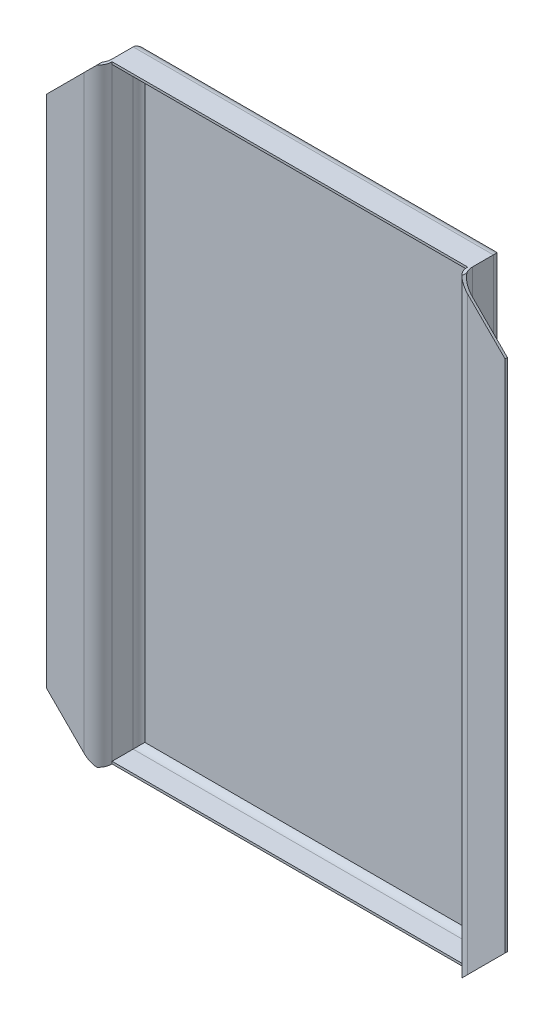
ISO-10303-21;
HEADER;
FILE_DESCRIPTION(('STEP AP214'),'2;1');
FILE_NAME('part.step','',(''),(''),'','','');
FILE_SCHEMA(('AUTOMOTIVE_DESIGN { 1 0 10303 214 1 1 1 1 }'));
ENDSEC;
DATA;
#1=APPLICATION_CONTEXT('core data for automotive mechanical design processes');
#2=APPLICATION_PROTOCOL_DEFINITION('international standard','automotive_design',2000,#1);
#3=PRODUCT_CONTEXT('',#1,'mechanical');
#4=PRODUCT('Part','Part','',(#3));
#5=PRODUCT_RELATED_PRODUCT_CATEGORY('part','',(#4));
#6=PRODUCT_DEFINITION_FORMATION('','',#4);
#7=PRODUCT_DEFINITION_CONTEXT('part definition',#1,'design');
#8=PRODUCT_DEFINITION('design','',#6,#7);
#9=PRODUCT_DEFINITION_SHAPE('','',#8);
#10=(LENGTH_UNIT() NAMED_UNIT(*) SI_UNIT(.MILLI.,.METRE.));
#11=(NAMED_UNIT(*) PLANE_ANGLE_UNIT() SI_UNIT($,.RADIAN.));
#12=(NAMED_UNIT(*) SI_UNIT($,.STERADIAN.) SOLID_ANGLE_UNIT());
#13=UNCERTAINTY_MEASURE_WITH_UNIT(LENGTH_MEASURE(1.E-05),#10,'distance_accuracy_value','');
#14=(GEOMETRIC_REPRESENTATION_CONTEXT(3) GLOBAL_UNCERTAINTY_ASSIGNED_CONTEXT((#13)) GLOBAL_UNIT_ASSIGNED_CONTEXT((#10,
#11,#12)) REPRESENTATION_CONTEXT('',''));
#15=CARTESIAN_POINT('',(0.,0.,0.));
#16=DIRECTION('',(0.,0.,1.));
#17=DIRECTION('',(1.,0.,0.));
#18=AXIS2_PLACEMENT_3D('',#15,#16,#17);
#19=CARTESIAN_POINT('',(36.5,63.,1.5));
#20=DIRECTION('',(0.,-1.,0.));
#21=DIRECTION('',(0.,0.,-1.));
#22=AXIS2_PLACEMENT_3D('',#19,#20,#21);
#23=PLANE('',#22);
#24=DIRECTION('',(-1.,0.,0.));
#25=VECTOR('',#24,1.);
#26=CARTESIAN_POINT('',(36.5,63.,0.5));
#27=LINE('',#26,#25);
#28=CARTESIAN_POINT('',(36.5,63.,0.5));
#29=VERTEX_POINT('',#28);
#30=CARTESIAN_POINT('',(-36.5,63.,0.5));
#31=VERTEX_POINT('',#30);
#32=EDGE_CURVE('E112',#29,#31,#27,.T.);
#33=ORIENTED_EDGE('',*,*,#32,.T.);
#34=DIRECTION('',(0.,0.,-1.));
#35=VECTOR('',#34,1.);
#36=CARTESIAN_POINT('',(-36.5,63.,1.5));
#37=LINE('',#36,#35);
#38=CARTESIAN_POINT('',(-36.5,63.,1.5));
#39=VERTEX_POINT('',#38);
#40=EDGE_CURVE('E12',#39,#31,#37,.T.);
#41=ORIENTED_EDGE('',*,*,#40,.F.);
#42=DIRECTION('',(-1.,0.,0.));
#43=VECTOR('',#42,1.);
#44=CARTESIAN_POINT('',(36.5,63.,1.5));
#45=LINE('',#44,#43);
#46=CARTESIAN_POINT('',(36.5,63.,1.5));
#47=VERTEX_POINT('',#46);
#48=EDGE_CURVE('E100',#47,#39,#45,.T.);
#49=ORIENTED_EDGE('',*,*,#48,.F.);
#50=DIRECTION('',(0.,0.,-1.));
#51=VECTOR('',#50,1.);
#52=CARTESIAN_POINT('',(36.5,63.,1.5));
#53=LINE('',#52,#51);
#54=EDGE_CURVE('E108',#47,#29,#53,.T.);
#55=ORIENTED_EDGE('',*,*,#54,.T.);
#56=EDGE_LOOP('',(#33,#41,#49,#55));
#57=FACE_BOUND('',#56,.T.);
#58=ADVANCED_FACE('F49',(#57),#23,.F.);
#59=CARTESIAN_POINT('',(-36.5,63.,1.5));
#60=DIRECTION('',(1.,0.,0.));
#61=DIRECTION('',(0.,1.,0.));
#62=AXIS2_PLACEMENT_3D('',#59,#60,#61);
#63=PLANE('',#62);
#64=DIRECTION('',(0.,-1.,0.));
#65=VECTOR('',#64,1.);
#66=CARTESIAN_POINT('',(-36.5,63.,0.5));
#67=LINE('',#66,#65);
#68=CARTESIAN_POINT('',(-36.5,-63.,0.5));
#69=VERTEX_POINT('',#68);
#70=EDGE_CURVE('E104',#31,#69,#67,.T.);
#71=ORIENTED_EDGE('',*,*,#70,.T.);
#72=DIRECTION('',(0.,0.,-1.));
#73=VECTOR('',#72,1.);
#74=CARTESIAN_POINT('',(-36.5,-63.,1.5));
#75=LINE('',#74,#73);
#76=CARTESIAN_POINT('',(-36.5,-63.,1.5));
#77=VERTEX_POINT('',#76);
#78=EDGE_CURVE('E57',#77,#69,#75,.T.);
#79=ORIENTED_EDGE('',*,*,#78,.F.);
#80=DIRECTION('',(0.,-1.,0.));
#81=VECTOR('',#80,1.);
#82=CARTESIAN_POINT('',(-36.5,63.,1.5));
#83=LINE('',#82,#81);
#84=EDGE_CURVE('E95',#39,#77,#83,.T.);
#85=ORIENTED_EDGE('',*,*,#84,.F.);
#86=ORIENTED_EDGE('',*,*,#40,.T.);
#87=EDGE_LOOP('',(#71,#79,#85,#86));
#88=FACE_BOUND('',#87,.T.);
#89=ADVANCED_FACE('F103',(#88),#63,.F.);
#90=CARTESIAN_POINT('',(-36.5,-63.,1.5));
#91=DIRECTION('',(0.,1.,0.));
#92=DIRECTION('',(0.,0.,1.));
#93=AXIS2_PLACEMENT_3D('',#90,#91,#92);
#94=PLANE('',#93);
#95=DIRECTION('',(1.,0.,0.));
#96=VECTOR('',#95,1.);
#97=CARTESIAN_POINT('',(-36.5,-63.,0.5));
#98=LINE('',#97,#96);
#99=CARTESIAN_POINT('',(36.5,-63.,0.5));
#100=VERTEX_POINT('',#99);
#101=EDGE_CURVE('E82',#69,#100,#98,.T.);
#102=ORIENTED_EDGE('',*,*,#101,.T.);
#103=DIRECTION('',(0.,0.,-1.));
#104=VECTOR('',#103,1.);
#105=CARTESIAN_POINT('',(36.5,-63.,1.5));
#106=LINE('',#105,#104);
#107=CARTESIAN_POINT('',(36.5,-63.,1.5));
#108=VERTEX_POINT('',#107);
#109=EDGE_CURVE('E105',#108,#100,#106,.T.);
#110=ORIENTED_EDGE('',*,*,#109,.F.);
#111=DIRECTION('',(1.,0.,0.));
#112=VECTOR('',#111,1.);
#113=CARTESIAN_POINT('',(-36.5,-63.,1.5));
#114=LINE('',#113,#112);
#115=EDGE_CURVE('E98',#77,#108,#114,.T.);
#116=ORIENTED_EDGE('',*,*,#115,.F.);
#117=ORIENTED_EDGE('',*,*,#78,.T.);
#118=EDGE_LOOP('',(#102,#110,#116,#117));
#119=FACE_BOUND('',#118,.T.);
#120=ADVANCED_FACE('F106',(#119),#94,.F.);
#121=CARTESIAN_POINT('',(36.5,-63.,1.5));
#122=DIRECTION('',(-1.,0.,0.));
#123=DIRECTION('',(0.,-1.,0.));
#124=AXIS2_PLACEMENT_3D('',#121,#122,#123);
#125=PLANE('',#124);
#126=DIRECTION('',(0.,1.,0.));
#127=VECTOR('',#126,1.);
#128=CARTESIAN_POINT('',(36.5,-63.,0.5));
#129=LINE('',#128,#127);
#130=EDGE_CURVE('E88',#100,#29,#129,.T.);
#131=ORIENTED_EDGE('',*,*,#130,.T.);
#132=ORIENTED_EDGE('',*,*,#54,.F.);
#133=DIRECTION('',(0.,1.,0.));
#134=VECTOR('',#133,1.);
#135=CARTESIAN_POINT('',(36.5,-63.,1.5));
#136=LINE('',#135,#134);
#137=EDGE_CURVE('E65',#108,#47,#136,.T.);
#138=ORIENTED_EDGE('',*,*,#137,.F.);
#139=ORIENTED_EDGE('',*,*,#109,.T.);
#140=EDGE_LOOP('',(#131,#132,#138,#139));
#141=FACE_BOUND('',#140,.T.);
#142=ADVANCED_FACE('F119',(#141),#125,.F.);
#143=CARTESIAN_POINT('',(0.,0.,1.5));
#144=DIRECTION('',(0.,0.,1.));
#145=DIRECTION('',(1.,0.,0.));
#146=AXIS2_PLACEMENT_3D('',#143,#144,#145);
#147=PLANE('',#146);
#148=ORIENTED_EDGE('',*,*,#48,.T.);
#149=ORIENTED_EDGE('',*,*,#84,.T.);
#150=ORIENTED_EDGE('',*,*,#115,.T.);
#151=ORIENTED_EDGE('',*,*,#137,.T.);
#152=EDGE_LOOP('',(#148,#149,#150,#151));
#153=FACE_BOUND('',#152,.T.);
#154=ADVANCED_FACE('F96',(#153),#147,.T.);
#155=CARTESIAN_POINT('',(0.,0.,0.5));
#156=DIRECTION('',(0.,0.,1.));
#157=DIRECTION('',(1.,0.,0.));
#158=AXIS2_PLACEMENT_3D('',#155,#156,#157);
#159=PLANE('',#158);
#160=ORIENTED_EDGE('',*,*,#32,.F.);
#161=ORIENTED_EDGE('',*,*,#130,.F.);
#162=ORIENTED_EDGE('',*,*,#101,.F.);
#163=ORIENTED_EDGE('',*,*,#70,.F.);
#164=EDGE_LOOP('',(#160,#161,#162,#163));
#165=FACE_BOUND('',#164,.T.);
#166=ADVANCED_FACE('F122',(#165),#159,.F.);
#167=CLOSED_SHELL('',(#58,#89,#120,#142,#154,#166));
#168=MANIFOLD_SOLID_BREP('B2',#167);
#169=CARTESIAN_POINT('',(0.,0.,10.));
#170=DIRECTION('',(0.,0.,1.));
#171=DIRECTION('',(1.,0.,0.));
#172=AXIS2_PLACEMENT_3D('',#169,#170,#171);
#173=PLANE('',#172);
#174=DIRECTION('',(-0.707106781186549,0.707106781186546,0.));
#175=VECTOR('',#174,1.);
#176=CARTESIAN_POINT('',(51.9999999999999,52.0000000000001,10.));
#177=LINE('',#176,#175);
#178=CARTESIAN_POINT('',(49.,55.,10.));
#179=VERTEX_POINT('',#178);
#180=CARTESIAN_POINT('',(41.,63.,10.));
#181=VERTEX_POINT('',#180);
#182=EDGE_CURVE('E424',#179,#181,#177,.T.);
#183=ORIENTED_EDGE('',*,*,#182,.T.);
#184=DIRECTION('',(0.,1.,0.));
#185=VECTOR('',#184,1.);
#186=CARTESIAN_POINT('',(41.,0.,10.));
#187=LINE('',#186,#185);
#188=CARTESIAN_POINT('',(41.,-63.,10.));
#189=VERTEX_POINT('',#188);
#190=EDGE_CURVE('E514',#181,#189,#187,.F.);
#191=ORIENTED_EDGE('',*,*,#190,.T.);
#192=DIRECTION('',(0.70710678118655,0.707106781186545,0.));
#193=VECTOR('',#192,1.);
#194=CARTESIAN_POINT('',(51.9999999999999,-52.0000000000002,10.));
#195=LINE('',#194,#193);
#196=CARTESIAN_POINT('',(49.,-55.,10.));
#197=VERTEX_POINT('',#196);
#198=EDGE_CURVE('E427',#189,#197,#195,.T.);
#199=ORIENTED_EDGE('',*,*,#198,.T.);
#200=DIRECTION('',(0.,-1.,0.));
#201=VECTOR('',#200,1.);
#202=CARTESIAN_POINT('',(49.,65.,10.));
#203=LINE('',#202,#201);
#204=EDGE_CURVE('E398',#179,#197,#203,.T.);
#205=ORIENTED_EDGE('',*,*,#204,.F.);
#206=EDGE_LOOP('',(#183,#191,#199,#205));
#207=FACE_BOUND('',#206,.T.);
#208=ADVANCED_FACE('F173',(#207),#173,.T.);
#209=DIRECTION('',(0.707106781186549,-0.707106781186547,0.));
#210=VECTOR('',#209,1.);
#211=CARTESIAN_POINT('',(-51.9999999999999,-52.0000000000001,10.));
#212=LINE('',#211,#210);
#213=CARTESIAN_POINT('',(-49.,-55.,10.));
#214=VERTEX_POINT('',#213);
#215=CARTESIAN_POINT('',(-41.,-63.,10.));
#216=VERTEX_POINT('',#215);
#217=EDGE_CURVE('E443',#214,#216,#212,.T.);
#218=ORIENTED_EDGE('',*,*,#217,.T.);
#219=DIRECTION('',(0.,1.,0.));
#220=VECTOR('',#219,1.);
#221=CARTESIAN_POINT('',(-41.,0.,10.));
#222=LINE('',#221,#220);
#223=CARTESIAN_POINT('',(-41.,62.9999999999999,10.));
#224=VERTEX_POINT('',#223);
#225=EDGE_CURVE('E512',#216,#224,#222,.T.);
#226=ORIENTED_EDGE('',*,*,#225,.T.);
#227=DIRECTION('',(-0.70710678118655,-0.707106781186546,0.));
#228=VECTOR('',#227,1.);
#229=CARTESIAN_POINT('',(-51.9999999999999,52.0000000000001,10.));
#230=LINE('',#229,#228);
#231=CARTESIAN_POINT('',(-49.,55.,10.));
#232=VERTEX_POINT('',#231);
#233=EDGE_CURVE('E441',#224,#232,#230,.T.);
#234=ORIENTED_EDGE('',*,*,#233,.T.);
#235=DIRECTION('',(0.,-1.,0.));
#236=VECTOR('',#235,1.);
#237=CARTESIAN_POINT('',(-49.,65.,10.));
#238=LINE('',#237,#236);
#239=EDGE_CURVE('E389',#232,#214,#238,.T.);
#240=ORIENTED_EDGE('',*,*,#239,.T.);
#241=EDGE_LOOP('',(#218,#226,#234,#240));
#242=FACE_BOUND('',#241,.T.);
#243=ADVANCED_FACE('F618',(#242),#173,.T.);
#244=CARTESIAN_POINT('',(38.5,65.,10.));
#245=DIRECTION('',(-1.,0.,0.));
#246=DIRECTION('',(0.,-1.,0.));
#247=AXIS2_PLACEMENT_3D('',#244,#245,#246);
#248=PLANE('',#247);
#249=DIRECTION('',(0.,0.,-1.));
#250=VECTOR('',#249,1.);
#251=CARTESIAN_POINT('',(38.5,65.,10.));
#252=LINE('',#251,#250);
#253=CARTESIAN_POINT('',(38.5,65.,6.5));
#254=VERTEX_POINT('',#253);
#255=CARTESIAN_POINT('',(38.5,65.,2.));
#256=VERTEX_POINT('',#255);
#257=EDGE_CURVE('E410',#254,#256,#252,.T.);
#258=ORIENTED_EDGE('',*,*,#257,.F.);
#259=DIRECTION('',(0.,1.,0.));
#260=VECTOR('',#259,1.);
#261=CARTESIAN_POINT('',(38.5,-65.,6.49999999999998));
#262=LINE('',#261,#260);
#263=CARTESIAN_POINT('',(38.5,-65.,6.49999999999998));
#264=VERTEX_POINT('',#263);
#265=EDGE_CURVE('E536',#254,#264,#262,.F.);
#266=ORIENTED_EDGE('',*,*,#265,.T.);
#267=DIRECTION('',(0.,0.,-1.));
#268=VECTOR('',#267,1.);
#269=CARTESIAN_POINT('',(38.5,-65.,10.));
#270=LINE('',#269,#268);
#271=CARTESIAN_POINT('',(38.5,-65.,2.));
#272=VERTEX_POINT('',#271);
#273=EDGE_CURVE('E404',#264,#272,#270,.T.);
#274=ORIENTED_EDGE('',*,*,#273,.T.);
#275=DIRECTION('',(0.,1.,0.));
#276=VECTOR('',#275,1.);
#277=CARTESIAN_POINT('',(38.5,65.,2.));
#278=LINE('',#277,#276);
#279=EDGE_CURVE('E467',#272,#256,#278,.T.);
#280=ORIENTED_EDGE('',*,*,#279,.T.);
#281=EDGE_LOOP('',(#258,#266,#274,#280));
#282=FACE_BOUND('',#281,.T.);
#283=ADVANCED_FACE('F577',(#282),#248,.F.);
#284=CARTESIAN_POINT('',(-38.5,65.,10.));
#285=DIRECTION('',(0.,-1.,0.));
#286=DIRECTION('',(0.,0.,-1.));
#287=AXIS2_PLACEMENT_3D('',#284,#285,#286);
#288=PLANE('',#287);
#289=DIRECTION('',(0.,0.,1.));
#290=VECTOR('',#289,1.);
#291=CARTESIAN_POINT('',(-38.9999999999999,65.,10.));
#292=LINE('',#291,#290);
#293=CARTESIAN_POINT('',(-38.9999999999999,65.,8.15831239517797));
#294=VERTEX_POINT('',#293);
#295=CARTESIAN_POINT('',(-38.9999999999999,65.,9.23606797749973));
#296=VERTEX_POINT('',#295);
#297=EDGE_CURVE('E446',#294,#296,#292,.T.);
#298=ORIENTED_EDGE('',*,*,#297,.T.);
#299=CARTESIAN_POINT('',(-41.,65.,7.));
#300=DIRECTION('',(0.,-1.,0.));
#301=DIRECTION('',(0.,0.,-1.));
#302=AXIS2_PLACEMENT_3D('',#299,#300,#301);
#303=CIRCLE('',#302,3.);
#304=CARTESIAN_POINT('',(-38.,65.,7.));
#305=VERTEX_POINT('',#304);
#306=EDGE_CURVE('E379',#296,#305,#303,.F.);
#307=ORIENTED_EDGE('',*,*,#306,.T.);
#308=DIRECTION('',(1.,0.,0.));
#309=VECTOR('',#308,1.);
#310=CARTESIAN_POINT('',(-38.5,65.,7.));
#311=LINE('',#310,#309);
#312=CARTESIAN_POINT('',(38.,65.,7.));
#313=VERTEX_POINT('',#312);
#314=EDGE_CURVE('E356',#305,#313,#311,.T.);
#315=ORIENTED_EDGE('',*,*,#314,.T.);
#316=CARTESIAN_POINT('',(41.,65.,7.));
#317=DIRECTION('',(0.,-1.,0.));
#318=DIRECTION('',(0.,0.,-1.));
#319=AXIS2_PLACEMENT_3D('',#316,#317,#318);
#320=CIRCLE('',#319,3.);
#321=CARTESIAN_POINT('',(38.9999999999999,65.,9.23606797749974));
#322=VERTEX_POINT('',#321);
#323=EDGE_CURVE('E371',#313,#322,#320,.F.);
#324=ORIENTED_EDGE('',*,*,#323,.T.);
#325=DIRECTION('',(0.,0.,-1.));
#326=VECTOR('',#325,1.);
#327=CARTESIAN_POINT('',(38.9999999999999,65.,9.5));
#328=LINE('',#327,#326);
#329=CARTESIAN_POINT('',(38.9999999999999,65.,8.15831239517802));
#330=VERTEX_POINT('',#329);
#331=EDGE_CURVE('E195',#322,#330,#328,.T.);
#332=ORIENTED_EDGE('',*,*,#331,.T.);
#333=CARTESIAN_POINT('',(41.5,65.,6.5));
#334=DIRECTION('',(0.,-1.,0.));
#335=DIRECTION('',(0.,0.,-1.));
#336=AXIS2_PLACEMENT_3D('',#333,#334,#335);
#337=CIRCLE('',#336,3.);
#338=EDGE_CURVE('E550',#330,#254,#337,.T.);
#339=ORIENTED_EDGE('',*,*,#338,.T.);
#340=ORIENTED_EDGE('',*,*,#257,.T.);
#341=DIRECTION('',(-1.,0.,0.));
#342=VECTOR('',#341,1.);
#343=CARTESIAN_POINT('',(-38.5,65.,2.));
#344=LINE('',#343,#342);
#345=CARTESIAN_POINT('',(-38.5,65.,2.));
#346=VERTEX_POINT('',#345);
#347=EDGE_CURVE('E449',#256,#346,#344,.T.);
#348=ORIENTED_EDGE('',*,*,#347,.T.);
#349=DIRECTION('',(0.,0.,-1.));
#350=VECTOR('',#349,1.);
#351=CARTESIAN_POINT('',(-38.5,65.,10.));
#352=LINE('',#351,#350);
#353=CARTESIAN_POINT('',(-38.5,65.,6.5));
#354=VERTEX_POINT('',#353);
#355=EDGE_CURVE('E408',#354,#346,#352,.T.);
#356=ORIENTED_EDGE('',*,*,#355,.F.);
#357=CARTESIAN_POINT('',(-41.5,65.,6.5));
#358=DIRECTION('',(0.,-1.,0.));
#359=DIRECTION('',(0.,0.,-1.));
#360=AXIS2_PLACEMENT_3D('',#357,#358,#359);
#361=CIRCLE('',#360,3.);
#362=EDGE_CURVE('E538',#354,#294,#361,.T.);
#363=ORIENTED_EDGE('',*,*,#362,.T.);
#364=EDGE_LOOP('',(#298,#307,#315,#324,#332,#339,#340,#348,#356,#363));
#365=FACE_BOUND('',#364,.T.);
#366=ADVANCED_FACE('F573',(#365),#288,.F.);
#367=CARTESIAN_POINT('',(-38.5,65.,10.));
#368=DIRECTION('',(1.,0.,0.));
#369=DIRECTION('',(0.,1.,0.));
#370=AXIS2_PLACEMENT_3D('',#367,#368,#369);
#371=PLANE('',#370);
#372=DIRECTION('',(0.,0.,-1.));
#373=VECTOR('',#372,1.);
#374=CARTESIAN_POINT('',(-38.5,-65.,10.));
#375=LINE('',#374,#373);
#376=CARTESIAN_POINT('',(-38.5,-65.,6.49999999999998));
#377=VERTEX_POINT('',#376);
#378=CARTESIAN_POINT('',(-38.5,-65.,2.));
#379=VERTEX_POINT('',#378);
#380=EDGE_CURVE('E406',#377,#379,#375,.T.);
#381=ORIENTED_EDGE('',*,*,#380,.F.);
#382=DIRECTION('',(0.,1.,0.));
#383=VECTOR('',#382,1.);
#384=CARTESIAN_POINT('',(-38.5,65.,6.5));
#385=LINE('',#384,#383);
#386=EDGE_CURVE('E528',#377,#354,#385,.T.);
#387=ORIENTED_EDGE('',*,*,#386,.T.);
#388=ORIENTED_EDGE('',*,*,#355,.T.);
#389=DIRECTION('',(0.,-1.,0.));
#390=VECTOR('',#389,1.);
#391=CARTESIAN_POINT('',(-38.5,65.,2.));
#392=LINE('',#391,#390);
#393=EDGE_CURVE('E461',#346,#379,#392,.T.);
#394=ORIENTED_EDGE('',*,*,#393,.T.);
#395=EDGE_LOOP('',(#381,#387,#388,#394));
#396=FACE_BOUND('',#395,.T.);
#397=ADVANCED_FACE('F593',(#396),#371,.F.);
#398=CARTESIAN_POINT('',(-38.5,-65.,10.));
#399=DIRECTION('',(0.,1.,0.));
#400=DIRECTION('',(0.,0.,1.));
#401=AXIS2_PLACEMENT_3D('',#398,#399,#400);
#402=PLANE('',#401);
#403=DIRECTION('',(-1.,0.,0.));
#404=VECTOR('',#403,1.);
#405=CARTESIAN_POINT('',(-38.5,-65.,7.));
#406=LINE('',#405,#404);
#407=CARTESIAN_POINT('',(38.,-65.,7.));
#408=VERTEX_POINT('',#407);
#409=CARTESIAN_POINT('',(-38.,-65.,7.));
#410=VERTEX_POINT('',#409);
#411=EDGE_CURVE('E346',#408,#410,#406,.T.);
#412=ORIENTED_EDGE('',*,*,#411,.T.);
#413=CARTESIAN_POINT('',(-41.,-65.,7.));
#414=DIRECTION('',(0.,1.,0.));
#415=DIRECTION('',(0.,0.,1.));
#416=AXIS2_PLACEMENT_3D('',#413,#414,#415);
#417=CIRCLE('',#416,3.);
#418=CARTESIAN_POINT('',(-39.,-65.,9.23606797749978));
#419=VERTEX_POINT('',#418);
#420=EDGE_CURVE('E373',#410,#419,#417,.F.);
#421=ORIENTED_EDGE('',*,*,#420,.T.);
#422=DIRECTION('',(0.,0.,-1.));
#423=VECTOR('',#422,1.);
#424=CARTESIAN_POINT('',(-39.,-65.,9.49999999999998));
#425=LINE('',#424,#423);
#426=CARTESIAN_POINT('',(-39.,-65.,8.15831239517804));
#427=VERTEX_POINT('',#426);
#428=EDGE_CURVE('E430',#419,#427,#425,.T.);
#429=ORIENTED_EDGE('',*,*,#428,.T.);
#430=CARTESIAN_POINT('',(-41.5,-65.,6.49999999999998));
#431=DIRECTION('',(0.,1.,0.));
#432=DIRECTION('',(0.,0.,1.));
#433=AXIS2_PLACEMENT_3D('',#430,#431,#432);
#434=CIRCLE('',#433,3.);
#435=EDGE_CURVE('E546',#427,#377,#434,.T.);
#436=ORIENTED_EDGE('',*,*,#435,.T.);
#437=ORIENTED_EDGE('',*,*,#380,.T.);
#438=DIRECTION('',(1.,0.,0.));
#439=VECTOR('',#438,1.);
#440=CARTESIAN_POINT('',(-38.5,-65.,2.));
#441=LINE('',#440,#439);
#442=EDGE_CURVE('E464',#379,#272,#441,.T.);
#443=ORIENTED_EDGE('',*,*,#442,.T.);
#444=ORIENTED_EDGE('',*,*,#273,.F.);
#445=CARTESIAN_POINT('',(41.5,-65.,6.49999999999998));
#446=DIRECTION('',(0.,1.,0.));
#447=DIRECTION('',(0.,0.,1.));
#448=AXIS2_PLACEMENT_3D('',#445,#446,#447);
#449=CIRCLE('',#448,3.);
#450=CARTESIAN_POINT('',(39.,-65.,8.15831239517801));
#451=VERTEX_POINT('',#450);
#452=EDGE_CURVE('E181',#264,#451,#449,.T.);
#453=ORIENTED_EDGE('',*,*,#452,.T.);
#454=DIRECTION('',(0.,0.,1.));
#455=VECTOR('',#454,1.);
#456=CARTESIAN_POINT('',(39.,-65.,10.));
#457=LINE('',#456,#455);
#458=CARTESIAN_POINT('',(39.,-65.,9.23606797749975));
#459=VERTEX_POINT('',#458);
#460=EDGE_CURVE('E187',#451,#459,#457,.T.);
#461=ORIENTED_EDGE('',*,*,#460,.T.);
#462=CARTESIAN_POINT('',(41.,-65.,7.));
#463=DIRECTION('',(0.,1.,0.));
#464=DIRECTION('',(0.,0.,1.));
#465=AXIS2_PLACEMENT_3D('',#462,#463,#464);
#466=CIRCLE('',#465,3.);
#467=EDGE_CURVE('E364',#459,#408,#466,.F.);
#468=ORIENTED_EDGE('',*,*,#467,.T.);
#469=EDGE_LOOP('',(#412,#421,#429,#436,#437,#443,#444,#453,#461,#468));
#470=FACE_BOUND('',#469,.T.);
#471=ADVANCED_FACE('F370',(#470),#402,.F.);
#472=CARTESIAN_POINT('',(0.,0.,0.));
#473=DIRECTION('',(0.,0.,1.));
#474=DIRECTION('',(1.,0.,0.));
#475=AXIS2_PLACEMENT_3D('',#472,#473,#474);
#476=PLANE('',#475);
#477=DIRECTION('',(0.,-1.,0.));
#478=VECTOR('',#477,1.);
#479=CARTESIAN_POINT('',(-36.5,0.,0.));
#480=LINE('',#479,#478);
#481=CARTESIAN_POINT('',(-36.5,-63.,0.));
#482=VERTEX_POINT('',#481);
#483=CARTESIAN_POINT('',(-36.5,63.,0.));
#484=VERTEX_POINT('',#483);
#485=EDGE_CURVE('E456',#482,#484,#480,.F.);
#486=ORIENTED_EDGE('',*,*,#485,.T.);
#487=DIRECTION('',(-1.,0.,0.));
#488=VECTOR('',#487,1.);
#489=CARTESIAN_POINT('',(0.,63.,0.));
#490=LINE('',#489,#488);
#491=CARTESIAN_POINT('',(36.5,63.,0.));
#492=VERTEX_POINT('',#491);
#493=EDGE_CURVE('E458',#484,#492,#490,.F.);
#494=ORIENTED_EDGE('',*,*,#493,.T.);
#495=DIRECTION('',(0.,1.,0.));
#496=VECTOR('',#495,1.);
#497=CARTESIAN_POINT('',(36.5,0.,0.));
#498=LINE('',#497,#496);
#499=CARTESIAN_POINT('',(36.5,-63.,0.));
#500=VERTEX_POINT('',#499);
#501=EDGE_CURVE('E452',#492,#500,#498,.F.);
#502=ORIENTED_EDGE('',*,*,#501,.T.);
#503=DIRECTION('',(1.,0.,0.));
#504=VECTOR('',#503,1.);
#505=CARTESIAN_POINT('',(0.,-63.,0.));
#506=LINE('',#505,#504);
#507=EDGE_CURVE('E454',#500,#482,#506,.F.);
#508=ORIENTED_EDGE('',*,*,#507,.T.);
#509=EDGE_LOOP('',(#486,#494,#502,#508));
#510=FACE_BOUND('',#509,.T.);
#511=ADVANCED_FACE('F687',(#510),#476,.F.);
#512=CARTESIAN_POINT('',(49.,65.,9.5));
#513=DIRECTION('',(0.,0.,1.));
#514=DIRECTION('',(0.,-1.,0.));
#515=AXIS2_PLACEMENT_3D('',#512,#513,#514);
#516=PLANE('',#515);
#517=DIRECTION('',(-0.70710678118655,-0.707106781186545,0.));
#518=VECTOR('',#517,1.);
#519=CARTESIAN_POINT('',(49.,-55.,9.49999999999999));
#520=LINE('',#519,#518);
#521=CARTESIAN_POINT('',(49.,-55.,9.49999999999999));
#522=VERTEX_POINT('',#521);
#523=CARTESIAN_POINT('',(41.5,-62.5,9.49999999999998));
#524=VERTEX_POINT('',#523);
#525=EDGE_CURVE('E420',#522,#524,#520,.T.);
#526=ORIENTED_EDGE('',*,*,#525,.T.);
#527=DIRECTION('',(0.,1.,0.));
#528=VECTOR('',#527,1.);
#529=CARTESIAN_POINT('',(41.5,65.,9.5));
#530=LINE('',#529,#528);
#531=CARTESIAN_POINT('',(41.5,62.5,9.5));
#532=VERTEX_POINT('',#531);
#533=EDGE_CURVE('E533',#524,#532,#530,.T.);
#534=ORIENTED_EDGE('',*,*,#533,.T.);
#535=DIRECTION('',(0.707106781186549,-0.707106781186546,0.));
#536=VECTOR('',#535,1.);
#537=CARTESIAN_POINT('',(49.,55.,9.5));
#538=LINE('',#537,#536);
#539=CARTESIAN_POINT('',(49.,55.,9.5));
#540=VERTEX_POINT('',#539);
#541=EDGE_CURVE('E418',#532,#540,#538,.T.);
#542=ORIENTED_EDGE('',*,*,#541,.T.);
#543=DIRECTION('',(0.,1.,0.));
#544=VECTOR('',#543,1.);
#545=CARTESIAN_POINT('',(49.,65.,9.5));
#546=LINE('',#545,#544);
#547=EDGE_CURVE('E401',#522,#540,#546,.T.);
#548=ORIENTED_EDGE('',*,*,#547,.F.);
#549=EDGE_LOOP('',(#526,#534,#542,#548));
#550=FACE_BOUND('',#549,.T.);
#551=ADVANCED_FACE('F561',(#550),#516,.F.);
#552=CARTESIAN_POINT('',(49.,0.,0.));
#553=DIRECTION('',(1.,0.,0.));
#554=DIRECTION('',(0.,1.,0.));
#555=AXIS2_PLACEMENT_3D('',#552,#553,#554);
#556=PLANE('',#555);
#557=ORIENTED_EDGE('',*,*,#204,.T.);
#558=DIRECTION('',(0.,0.,-1.));
#559=VECTOR('',#558,1.);
#560=CARTESIAN_POINT('',(49.,-55.,9.49999999999998));
#561=LINE('',#560,#559);
#562=EDGE_CURVE('E415',#197,#522,#561,.T.);
#563=ORIENTED_EDGE('',*,*,#562,.T.);
#564=ORIENTED_EDGE('',*,*,#547,.T.);
#565=DIRECTION('',(0.,0.,1.));
#566=VECTOR('',#565,1.);
#567=CARTESIAN_POINT('',(49.,55.,10.));
#568=LINE('',#567,#566);
#569=EDGE_CURVE('E412',#540,#179,#568,.T.);
#570=ORIENTED_EDGE('',*,*,#569,.T.);
#571=EDGE_LOOP('',(#557,#563,#564,#570));
#572=FACE_BOUND('',#571,.T.);
#573=ADVANCED_FACE('F565',(#572),#556,.T.);
#574=CARTESIAN_POINT('',(49.,-55.,0.));
#575=DIRECTION('',(0.707106781186545,-0.70710678118655,0.));
#576=DIRECTION('',(0.,0.,1.));
#577=AXIS2_PLACEMENT_3D('',#574,#575,#576);
#578=PLANE('',#577);
#579=CARTESIAN_POINT('',(41.,-62.9999999999999,7.));
#580=DIRECTION('',(0.707106781186545,-0.70710678118655,0.));
#581=DIRECTION('',(0.70710678118655,0.707106781186545,0.));
#582=AXIS2_PLACEMENT_3D('',#579,#580,#581);
#583=ELLIPSE('',#582,4.24264068711927,3.);
#584=EDGE_CURVE('E518',#189,#459,#583,.T.);
#585=ORIENTED_EDGE('',*,*,#584,.T.);
#586=ORIENTED_EDGE('',*,*,#460,.F.);
#587=CARTESIAN_POINT('',(41.5,-62.5,6.49999999999998));
#588=DIRECTION('',(0.707106781186545,-0.70710678118655,0.));
#589=DIRECTION('',(-0.70710678118655,-0.707106781186545,0.));
#590=AXIS2_PLACEMENT_3D('',#587,#588,#589);
#591=ELLIPSE('',#590,4.24264068711927,3.);
#592=EDGE_CURVE('E47',#451,#524,#591,.F.);
#593=ORIENTED_EDGE('',*,*,#592,.T.);
#594=ORIENTED_EDGE('',*,*,#525,.F.);
#595=ORIENTED_EDGE('',*,*,#562,.F.);
#596=ORIENTED_EDGE('',*,*,#198,.F.);
#597=EDGE_LOOP('',(#585,#586,#593,#594,#595,#596));
#598=FACE_BOUND('',#597,.T.);
#599=ADVANCED_FACE('F557',(#598),#578,.T.);
#600=CARTESIAN_POINT('',(49.,55.,0.));
#601=DIRECTION('',(0.707106781186546,0.707106781186549,0.));
#602=DIRECTION('',(0.,0.,-1.));
#603=AXIS2_PLACEMENT_3D('',#600,#601,#602);
#604=PLANE('',#603);
#605=ORIENTED_EDGE('',*,*,#331,.F.);
#606=CARTESIAN_POINT('',(41.,63.,7.));
#607=DIRECTION('',(0.707106781186546,0.707106781186549,0.));
#608=DIRECTION('',(-0.707106781186549,0.707106781186546,0.));
#609=AXIS2_PLACEMENT_3D('',#606,#607,#608);
#610=ELLIPSE('',#609,4.24264068711928,3.);
#611=EDGE_CURVE('E516',#322,#181,#610,.T.);
#612=ORIENTED_EDGE('',*,*,#611,.T.);
#613=ORIENTED_EDGE('',*,*,#182,.F.);
#614=ORIENTED_EDGE('',*,*,#569,.F.);
#615=ORIENTED_EDGE('',*,*,#541,.F.);
#616=CARTESIAN_POINT('',(41.5,62.5,6.5));
#617=DIRECTION('',(0.707106781186546,0.707106781186549,0.));
#618=DIRECTION('',(0.707106781186549,-0.707106781186546,0.));
#619=AXIS2_PLACEMENT_3D('',#616,#617,#618);
#620=ELLIPSE('',#619,4.24264068711928,3.);
#621=EDGE_CURVE('E548',#532,#330,#620,.F.);
#622=ORIENTED_EDGE('',*,*,#621,.T.);
#623=EDGE_LOOP('',(#605,#612,#613,#614,#615,#622));
#624=FACE_BOUND('',#623,.T.);
#625=ADVANCED_FACE('F568',(#624),#604,.T.);
#626=CARTESIAN_POINT('',(-49.,65.,9.5));
#627=DIRECTION('',(0.,0.,-1.));
#628=DIRECTION('',(0.,1.,0.));
#629=AXIS2_PLACEMENT_3D('',#626,#627,#628);
#630=PLANE('',#629);
#631=DIRECTION('',(0.707106781186549,0.707106781186546,0.));
#632=VECTOR('',#631,1.);
#633=CARTESIAN_POINT('',(-44.,60.,9.5));
#634=LINE('',#633,#632);
#635=CARTESIAN_POINT('',(-49.,55.,9.5));
#636=VERTEX_POINT('',#635);
#637=CARTESIAN_POINT('',(-41.5,62.4999999999999,9.5));
#638=VERTEX_POINT('',#637);
#639=EDGE_CURVE('E432',#636,#638,#634,.T.);
#640=ORIENTED_EDGE('',*,*,#639,.T.);
#641=DIRECTION('',(0.,1.,0.));
#642=VECTOR('',#641,1.);
#643=CARTESIAN_POINT('',(-41.5,65.,9.5));
#644=LINE('',#643,#642);
#645=CARTESIAN_POINT('',(-41.5,-62.5,9.49999999999998));
#646=VERTEX_POINT('',#645);
#647=EDGE_CURVE('E531',#638,#646,#644,.F.);
#648=ORIENTED_EDGE('',*,*,#647,.T.);
#649=DIRECTION('',(-0.707106781186548,0.707106781186546,0.));
#650=VECTOR('',#649,1.);
#651=CARTESIAN_POINT('',(-109.,4.99999999999983,9.49999999999999));
#652=LINE('',#651,#650);
#653=CARTESIAN_POINT('',(-49.,-55.,9.49999999999999));
#654=VERTEX_POINT('',#653);
#655=EDGE_CURVE('E435',#646,#654,#652,.T.);
#656=ORIENTED_EDGE('',*,*,#655,.T.);
#657=DIRECTION('',(0.,1.,0.));
#658=VECTOR('',#657,1.);
#659=CARTESIAN_POINT('',(-49.,65.,9.5));
#660=LINE('',#659,#658);
#661=EDGE_CURVE('E395',#654,#636,#660,.T.);
#662=ORIENTED_EDGE('',*,*,#661,.T.);
#663=EDGE_LOOP('',(#640,#648,#656,#662));
#664=FACE_BOUND('',#663,.T.);
#665=ADVANCED_FACE('F606',(#664),#630,.T.);
#666=CARTESIAN_POINT('',(-49.,0.,0.));
#667=DIRECTION('',(-1.,0.,0.));
#668=DIRECTION('',(0.,1.,0.));
#669=AXIS2_PLACEMENT_3D('',#666,#667,#668);
#670=PLANE('',#669);
#671=ORIENTED_EDGE('',*,*,#661,.F.);
#672=DIRECTION('',(0.,0.,1.));
#673=VECTOR('',#672,1.);
#674=CARTESIAN_POINT('',(-49.,-55.,10.));
#675=LINE('',#674,#673);
#676=EDGE_CURVE('E439',#654,#214,#675,.T.);
#677=ORIENTED_EDGE('',*,*,#676,.T.);
#678=ORIENTED_EDGE('',*,*,#239,.F.);
#679=DIRECTION('',(0.,0.,-1.));
#680=VECTOR('',#679,1.);
#681=CARTESIAN_POINT('',(-49.,55.,9.5));
#682=LINE('',#681,#680);
#683=EDGE_CURVE('E437',#232,#636,#682,.T.);
#684=ORIENTED_EDGE('',*,*,#683,.T.);
#685=EDGE_LOOP('',(#671,#677,#678,#684));
#686=FACE_BOUND('',#685,.T.);
#687=ADVANCED_FACE('F611',(#686),#670,.T.);
#688=CARTESIAN_POINT('',(-39.,-65.,10.));
#689=DIRECTION('',(-0.707106781186546,-0.707106781186548,0.));
#690=DIRECTION('',(0.,0.,1.));
#691=AXIS2_PLACEMENT_3D('',#688,#689,#690);
#692=PLANE('',#691);
#693=ORIENTED_EDGE('',*,*,#428,.F.);
#694=CARTESIAN_POINT('',(-41.,-63.,7.));
#695=DIRECTION('',(-0.707106781186546,-0.707106781186548,0.));
#696=DIRECTION('',(-0.707106781186549,0.707106781186547,0.));
#697=AXIS2_PLACEMENT_3D('',#694,#695,#696);
#698=ELLIPSE('',#697,4.24264068711928,3.);
#699=EDGE_CURVE('E520',#419,#216,#698,.T.);
#700=ORIENTED_EDGE('',*,*,#699,.T.);
#701=ORIENTED_EDGE('',*,*,#217,.F.);
#702=ORIENTED_EDGE('',*,*,#676,.F.);
#703=ORIENTED_EDGE('',*,*,#655,.F.);
#704=CARTESIAN_POINT('',(-41.5,-62.5,6.49999999999998));
#705=DIRECTION('',(-0.707106781186546,-0.707106781186548,0.));
#706=DIRECTION('',(-0.707106781186549,0.707106781186547,0.));
#707=AXIS2_PLACEMENT_3D('',#704,#705,#706);
#708=ELLIPSE('',#707,4.24264068711928,3.);
#709=EDGE_CURVE('E543',#646,#427,#708,.F.);
#710=ORIENTED_EDGE('',*,*,#709,.T.);
#711=EDGE_LOOP('',(#693,#700,#701,#702,#703,#710));
#712=FACE_BOUND('',#711,.T.);
#713=ADVANCED_FACE('F616',(#712),#692,.T.);
#714=CARTESIAN_POINT('',(-38.9999999999999,65.,10.));
#715=DIRECTION('',(-0.707106781186546,0.70710678118655,0.));
#716=DIRECTION('',(0.,0.,-1.));
#717=AXIS2_PLACEMENT_3D('',#714,#715,#716);
#718=PLANE('',#717);
#719=CARTESIAN_POINT('',(-41.,62.9999999999999,7.));
#720=DIRECTION('',(-0.707106781186546,0.70710678118655,0.));
#721=DIRECTION('',(0.70710678118655,0.707106781186546,0.));
#722=AXIS2_PLACEMENT_3D('',#719,#720,#721);
#723=ELLIPSE('',#722,4.24264068711927,3.);
#724=EDGE_CURVE('E523',#224,#296,#723,.T.);
#725=ORIENTED_EDGE('',*,*,#724,.T.);
#726=ORIENTED_EDGE('',*,*,#297,.F.);
#727=CARTESIAN_POINT('',(-41.5,62.4999999999999,6.5));
#728=DIRECTION('',(-0.707106781186546,0.70710678118655,0.));
#729=DIRECTION('',(0.70710678118655,0.707106781186546,0.));
#730=AXIS2_PLACEMENT_3D('',#727,#728,#729);
#731=ELLIPSE('',#730,4.24264068711927,3.);
#732=EDGE_CURVE('E541',#294,#638,#731,.F.);
#733=ORIENTED_EDGE('',*,*,#732,.T.);
#734=ORIENTED_EDGE('',*,*,#639,.F.);
#735=ORIENTED_EDGE('',*,*,#683,.F.);
#736=ORIENTED_EDGE('',*,*,#233,.F.);
#737=EDGE_LOOP('',(#725,#726,#733,#734,#735,#736));
#738=FACE_BOUND('',#737,.T.);
#739=ADVANCED_FACE('F603',(#738),#718,.T.);
#740=CARTESIAN_POINT('',(38.,65.,10.));
#741=DIRECTION('',(-1.,0.,0.));
#742=DIRECTION('',(0.,-1.,0.));
#743=AXIS2_PLACEMENT_3D('',#740,#741,#742);
#744=PLANE('',#743);
#745=DIRECTION('',(0.,0.,-1.));
#746=VECTOR('',#745,1.);
#747=CARTESIAN_POINT('',(38.,-64.5,10.));
#748=LINE('',#747,#746);
#749=CARTESIAN_POINT('',(38.,-64.5,7.));
#750=VERTEX_POINT('',#749);
#751=CARTESIAN_POINT('',(38.,-64.5,2.5));
#752=VERTEX_POINT('',#751);
#753=EDGE_CURVE('E383',#750,#752,#748,.T.);
#754=ORIENTED_EDGE('',*,*,#753,.F.);
#755=DIRECTION('',(0.,1.,0.));
#756=VECTOR('',#755,1.);
#757=CARTESIAN_POINT('',(38.,65.,7.));
#758=LINE('',#757,#756);
#759=CARTESIAN_POINT('',(38.,64.5,7.));
#760=VERTEX_POINT('',#759);
#761=EDGE_CURVE('E366',#750,#760,#758,.T.);
#762=ORIENTED_EDGE('',*,*,#761,.T.);
#763=DIRECTION('',(0.,0.,-1.));
#764=VECTOR('',#763,1.);
#765=CARTESIAN_POINT('',(38.,64.5,10.));
#766=LINE('',#765,#764);
#767=CARTESIAN_POINT('',(38.,64.5,2.5));
#768=VERTEX_POINT('',#767);
#769=EDGE_CURVE('E387',#760,#768,#766,.T.);
#770=ORIENTED_EDGE('',*,*,#769,.T.);
#771=DIRECTION('',(0.,1.,0.));
#772=VECTOR('',#771,1.);
#773=CARTESIAN_POINT('',(38.,-64.5,2.5));
#774=LINE('',#773,#772);
#775=EDGE_CURVE('E488',#768,#752,#774,.F.);
#776=ORIENTED_EDGE('',*,*,#775,.T.);
#777=EDGE_LOOP('',(#754,#762,#770,#776));
#778=FACE_BOUND('',#777,.T.);
#779=ADVANCED_FACE('F639',(#778),#744,.T.);
#780=CARTESIAN_POINT('',(-38.5,64.5,10.));
#781=DIRECTION('',(0.,-1.,0.));
#782=DIRECTION('',(0.,0.,-1.));
#783=AXIS2_PLACEMENT_3D('',#780,#781,#782);
#784=PLANE('',#783);
#785=DIRECTION('',(1.,0.,0.));
#786=VECTOR('',#785,1.);
#787=CARTESIAN_POINT('',(-38.5,64.5,7.));
#788=LINE('',#787,#786);
#789=CARTESIAN_POINT('',(-38.,64.5,7.));
#790=VERTEX_POINT('',#789);
#791=EDGE_CURVE('E357',#790,#760,#788,.T.);
#792=ORIENTED_EDGE('',*,*,#791,.F.);
#793=DIRECTION('',(0.,0.,-1.));
#794=VECTOR('',#793,1.);
#795=CARTESIAN_POINT('',(-38.,64.5,10.));
#796=LINE('',#795,#794);
#797=CARTESIAN_POINT('',(-38.,64.5,2.5));
#798=VERTEX_POINT('',#797);
#799=EDGE_CURVE('E390',#790,#798,#796,.T.);
#800=ORIENTED_EDGE('',*,*,#799,.T.);
#801=DIRECTION('',(-1.,0.,0.));
#802=VECTOR('',#801,1.);
#803=CARTESIAN_POINT('',(38.,64.5,2.5));
#804=LINE('',#803,#802);
#805=EDGE_CURVE('E485',#798,#768,#804,.F.);
#806=ORIENTED_EDGE('',*,*,#805,.T.);
#807=ORIENTED_EDGE('',*,*,#769,.F.);
#808=EDGE_LOOP('',(#792,#800,#806,#807));
#809=FACE_BOUND('',#808,.T.);
#810=ADVANCED_FACE('F640',(#809),#784,.T.);
#811=CARTESIAN_POINT('',(-38.,65.,10.));
#812=DIRECTION('',(1.,0.,0.));
#813=DIRECTION('',(0.,1.,0.));
#814=AXIS2_PLACEMENT_3D('',#811,#812,#813);
#815=PLANE('',#814);
#816=ORIENTED_EDGE('',*,*,#799,.F.);
#817=DIRECTION('',(0.,1.,0.));
#818=VECTOR('',#817,1.);
#819=CARTESIAN_POINT('',(-38.,65.,7.));
#820=LINE('',#819,#818);
#821=CARTESIAN_POINT('',(-38.,-64.5,7.));
#822=VERTEX_POINT('',#821);
#823=EDGE_CURVE('E525',#790,#822,#820,.F.);
#824=ORIENTED_EDGE('',*,*,#823,.T.);
#825=DIRECTION('',(0.,0.,-1.));
#826=VECTOR('',#825,1.);
#827=CARTESIAN_POINT('',(-38.,-64.5,10.));
#828=LINE('',#827,#826);
#829=CARTESIAN_POINT('',(-38.,-64.5,2.5));
#830=VERTEX_POINT('',#829);
#831=EDGE_CURVE('E385',#822,#830,#828,.T.);
#832=ORIENTED_EDGE('',*,*,#831,.T.);
#833=DIRECTION('',(0.,-1.,0.));
#834=VECTOR('',#833,1.);
#835=CARTESIAN_POINT('',(-38.,64.5,2.5));
#836=LINE('',#835,#834);
#837=EDGE_CURVE('E482',#830,#798,#836,.F.);
#838=ORIENTED_EDGE('',*,*,#837,.T.);
#839=EDGE_LOOP('',(#816,#824,#832,#838));
#840=FACE_BOUND('',#839,.T.);
#841=ADVANCED_FACE('F662',(#840),#815,.T.);
#842=CARTESIAN_POINT('',(-38.5,-64.5,10.));
#843=DIRECTION('',(0.,1.,0.));
#844=DIRECTION('',(0.,0.,1.));
#845=AXIS2_PLACEMENT_3D('',#842,#843,#844);
#846=PLANE('',#845);
#847=DIRECTION('',(-1.,0.,0.));
#848=VECTOR('',#847,1.);
#849=CARTESIAN_POINT('',(-38.5,-64.5,7.));
#850=LINE('',#849,#848);
#851=EDGE_CURVE('E630',#750,#822,#850,.T.);
#852=ORIENTED_EDGE('',*,*,#851,.F.);
#853=ORIENTED_EDGE('',*,*,#753,.T.);
#854=DIRECTION('',(1.,0.,0.));
#855=VECTOR('',#854,1.);
#856=CARTESIAN_POINT('',(-38.,-64.5,2.5));
#857=LINE('',#856,#855);
#858=EDGE_CURVE('E479',#752,#830,#857,.F.);
#859=ORIENTED_EDGE('',*,*,#858,.T.);
#860=ORIENTED_EDGE('',*,*,#831,.F.);
#861=EDGE_LOOP('',(#852,#853,#859,#860));
#862=FACE_BOUND('',#861,.T.);
#863=ADVANCED_FACE('F660',(#862),#846,.T.);
#864=CARTESIAN_POINT('',(0.,0.,0.5));
#865=DIRECTION('',(0.,0.,1.));
#866=DIRECTION('',(1.,0.,0.));
#867=AXIS2_PLACEMENT_3D('',#864,#865,#866);
#868=PLANE('',#867);
#869=DIRECTION('',(0.,-1.,0.));
#870=VECTOR('',#869,1.);
#871=CARTESIAN_POINT('',(-36.,-64.5,0.5));
#872=LINE('',#871,#870);
#873=CARTESIAN_POINT('',(-36.,62.5,0.5));
#874=VERTEX_POINT('',#873);
#875=CARTESIAN_POINT('',(-36.,-62.5,0.5));
#876=VERTEX_POINT('',#875);
#877=EDGE_CURVE('E474',#874,#876,#872,.T.);
#878=ORIENTED_EDGE('',*,*,#877,.T.);
#879=DIRECTION('',(1.,0.,0.));
#880=VECTOR('',#879,1.);
#881=CARTESIAN_POINT('',(38.,-62.5,0.5));
#882=LINE('',#881,#880);
#883=CARTESIAN_POINT('',(36.,-62.5,0.5));
#884=VERTEX_POINT('',#883);
#885=EDGE_CURVE('E476',#876,#884,#882,.T.);
#886=ORIENTED_EDGE('',*,*,#885,.T.);
#887=DIRECTION('',(0.,1.,0.));
#888=VECTOR('',#887,1.);
#889=CARTESIAN_POINT('',(36.,64.5,0.5));
#890=LINE('',#889,#888);
#891=CARTESIAN_POINT('',(36.,62.5,0.5));
#892=VERTEX_POINT('',#891);
#893=EDGE_CURVE('E470',#884,#892,#890,.T.);
#894=ORIENTED_EDGE('',*,*,#893,.T.);
#895=DIRECTION('',(-1.,0.,0.));
#896=VECTOR('',#895,1.);
#897=CARTESIAN_POINT('',(-38.,62.5,0.5));
#898=LINE('',#897,#896);
#899=EDGE_CURVE('E472',#892,#874,#898,.T.);
#900=ORIENTED_EDGE('',*,*,#899,.T.);
#901=EDGE_LOOP('',(#878,#886,#894,#900));
#902=FACE_BOUND('',#901,.T.);
#903=ADVANCED_FACE('F667',(#902),#868,.T.);
#904=CARTESIAN_POINT('',(-38.5,-63.,2.));
#905=DIRECTION('',(1.,0.,0.));
#906=DIRECTION('',(0.,0.,-1.));
#907=AXIS2_PLACEMENT_3D('',#904,#905,#906);
#908=CYLINDRICAL_SURFACE('',#907,2.);
#909=CARTESIAN_POINT('',(-36.5,-63.,2.));
#910=DIRECTION('',(0.707106781186547,-0.707106781186547,0.));
#911=DIRECTION('',(0.707106781186547,0.707106781186548,0.));
#912=AXIS2_PLACEMENT_3D('',#909,#910,#911);
#913=ELLIPSE('',#912,2.82842712474619,2.);
#914=EDGE_CURVE('E497',#482,#379,#913,.F.);
#915=ORIENTED_EDGE('',*,*,#914,.F.);
#916=ORIENTED_EDGE('',*,*,#507,.F.);
#917=CARTESIAN_POINT('',(36.5,-63.,2.));
#918=DIRECTION('',(0.707106781186547,0.707106781186548,0.));
#919=DIRECTION('',(-0.707106781186547,0.707106781186547,0.));
#920=AXIS2_PLACEMENT_3D('',#917,#918,#919);
#921=ELLIPSE('',#920,2.82842712474619,2.);
#922=EDGE_CURVE('E386',#272,#500,#921,.T.);
#923=ORIENTED_EDGE('',*,*,#922,.F.);
#924=ORIENTED_EDGE('',*,*,#442,.F.);
#925=EDGE_LOOP('',(#915,#916,#923,#924));
#926=FACE_BOUND('',#925,.T.);
#927=ADVANCED_FACE('F669',(#926),#908,.T.);
#928=CARTESIAN_POINT('',(36.5,65.,2.));
#929=DIRECTION('',(0.,1.,0.));
#930=DIRECTION('',(-1.,0.,0.));
#931=AXIS2_PLACEMENT_3D('',#928,#929,#930);
#932=CYLINDRICAL_SURFACE('',#931,2.);
#933=ORIENTED_EDGE('',*,*,#922,.T.);
#934=ORIENTED_EDGE('',*,*,#501,.F.);
#935=CARTESIAN_POINT('',(36.5,63.,2.));
#936=DIRECTION('',(-0.707106781186547,0.707106781186547,0.));
#937=DIRECTION('',(0.707106781186547,0.707106781186548,0.));
#938=AXIS2_PLACEMENT_3D('',#935,#936,#937);
#939=ELLIPSE('',#938,2.82842712474619,2.);
#940=EDGE_CURVE('E494',#256,#492,#939,.T.);
#941=ORIENTED_EDGE('',*,*,#940,.F.);
#942=ORIENTED_EDGE('',*,*,#279,.F.);
#943=EDGE_LOOP('',(#933,#934,#941,#942));
#944=FACE_BOUND('',#943,.T.);
#945=ADVANCED_FACE('F583',(#944),#932,.T.);
#946=CARTESIAN_POINT('',(-36.5,65.,2.));
#947=DIRECTION('',(0.,-1.,0.));
#948=DIRECTION('',(1.,0.,0.));
#949=AXIS2_PLACEMENT_3D('',#946,#947,#948);
#950=CYLINDRICAL_SURFACE('',#949,2.);
#951=ORIENTED_EDGE('',*,*,#914,.T.);
#952=ORIENTED_EDGE('',*,*,#393,.F.);
#953=CARTESIAN_POINT('',(-36.5,63.,2.));
#954=DIRECTION('',(-0.707106781186547,-0.707106781186548,0.));
#955=DIRECTION('',(0.707106781186547,-0.707106781186547,0.));
#956=AXIS2_PLACEMENT_3D('',#953,#954,#955);
#957=ELLIPSE('',#956,2.82842712474619,2.);
#958=EDGE_CURVE('E491',#484,#346,#957,.F.);
#959=ORIENTED_EDGE('',*,*,#958,.F.);
#960=ORIENTED_EDGE('',*,*,#485,.F.);
#961=EDGE_LOOP('',(#951,#952,#959,#960));
#962=FACE_BOUND('',#961,.T.);
#963=ADVANCED_FACE('F721',(#962),#950,.T.);
#964=CARTESIAN_POINT('',(-38.5,63.,2.));
#965=DIRECTION('',(-1.,0.,0.));
#966=DIRECTION('',(0.,0.,1.));
#967=AXIS2_PLACEMENT_3D('',#964,#965,#966);
#968=CYLINDRICAL_SURFACE('',#967,2.);
#969=ORIENTED_EDGE('',*,*,#940,.T.);
#970=ORIENTED_EDGE('',*,*,#493,.F.);
#971=ORIENTED_EDGE('',*,*,#958,.T.);
#972=ORIENTED_EDGE('',*,*,#347,.F.);
#973=EDGE_LOOP('',(#969,#970,#971,#972));
#974=FACE_BOUND('',#973,.T.);
#975=ADVANCED_FACE('F586',(#974),#968,.T.);
#976=CARTESIAN_POINT('',(0.,62.5,2.5));
#977=DIRECTION('',(1.,0.,0.));
#978=DIRECTION('',(0.,0.,-1.));
#979=AXIS2_PLACEMENT_3D('',#976,#977,#978);
#980=CYLINDRICAL_SURFACE('',#979,2.);
#981=CARTESIAN_POINT('',(36.,62.5,2.5));
#982=DIRECTION('',(0.707106781186547,-0.707106781186547,0.));
#983=DIRECTION('',(0.707106781186547,0.707106781186548,0.));
#984=AXIS2_PLACEMENT_3D('',#981,#982,#983);
#985=ELLIPSE('',#984,2.82842712474619,2.);
#986=EDGE_CURVE('E506',#768,#892,#985,.F.);
#987=ORIENTED_EDGE('',*,*,#986,.F.);
#988=ORIENTED_EDGE('',*,*,#805,.F.);
#989=CARTESIAN_POINT('',(-36.,62.5,2.5));
#990=DIRECTION('',(0.707106781186547,0.707106781186548,0.));
#991=DIRECTION('',(-0.707106781186547,0.707106781186547,0.));
#992=AXIS2_PLACEMENT_3D('',#989,#990,#991);
#993=ELLIPSE('',#992,2.82842712474619,2.);
#994=EDGE_CURVE('E495',#874,#798,#993,.T.);
#995=ORIENTED_EDGE('',*,*,#994,.F.);
#996=ORIENTED_EDGE('',*,*,#899,.F.);
#997=EDGE_LOOP('',(#987,#988,#995,#996));
#998=FACE_BOUND('',#997,.T.);
#999=ADVANCED_FACE('F647',(#998),#980,.F.);
#1000=CARTESIAN_POINT('',(-36.,0.,2.5));
#1001=DIRECTION('',(0.,1.,0.));
#1002=DIRECTION('',(-1.,0.,0.));
#1003=AXIS2_PLACEMENT_3D('',#1000,#1001,#1002);
#1004=CYLINDRICAL_SURFACE('',#1003,2.);
#1005=ORIENTED_EDGE('',*,*,#994,.T.);
#1006=ORIENTED_EDGE('',*,*,#837,.F.);
#1007=CARTESIAN_POINT('',(-36.,-62.5,2.5));
#1008=DIRECTION('',(-0.707106781186547,0.707106781186547,0.));
#1009=DIRECTION('',(-0.707106781186547,-0.707106781186548,0.));
#1010=AXIS2_PLACEMENT_3D('',#1007,#1008,#1009);
#1011=ELLIPSE('',#1010,2.82842712474619,2.);
#1012=EDGE_CURVE('E503',#876,#830,#1011,.T.);
#1013=ORIENTED_EDGE('',*,*,#1012,.F.);
#1014=ORIENTED_EDGE('',*,*,#877,.F.);
#1015=EDGE_LOOP('',(#1005,#1006,#1013,#1014));
#1016=FACE_BOUND('',#1015,.T.);
#1017=ADVANCED_FACE('F664',(#1016),#1004,.F.);
#1018=CARTESIAN_POINT('',(36.,0.,2.5));
#1019=DIRECTION('',(0.,-1.,0.));
#1020=DIRECTION('',(1.,0.,0.));
#1021=AXIS2_PLACEMENT_3D('',#1018,#1019,#1020);
#1022=CYLINDRICAL_SURFACE('',#1021,2.);
#1023=ORIENTED_EDGE('',*,*,#986,.T.);
#1024=ORIENTED_EDGE('',*,*,#893,.F.);
#1025=CARTESIAN_POINT('',(36.,-62.5,2.5));
#1026=DIRECTION('',(-0.707106781186547,-0.707106781186548,0.));
#1027=DIRECTION('',(-0.707106781186547,0.707106781186547,0.));
#1028=AXIS2_PLACEMENT_3D('',#1025,#1026,#1027);
#1029=ELLIPSE('',#1028,2.82842712474619,2.);
#1030=EDGE_CURVE('E382',#752,#884,#1029,.F.);
#1031=ORIENTED_EDGE('',*,*,#1030,.F.);
#1032=ORIENTED_EDGE('',*,*,#775,.F.);
#1033=EDGE_LOOP('',(#1023,#1024,#1031,#1032));
#1034=FACE_BOUND('',#1033,.T.);
#1035=ADVANCED_FACE('F651',(#1034),#1022,.F.);
#1036=CARTESIAN_POINT('',(0.,-62.5,2.5));
#1037=DIRECTION('',(-1.,0.,0.));
#1038=DIRECTION('',(0.,0.,1.));
#1039=AXIS2_PLACEMENT_3D('',#1036,#1037,#1038);
#1040=CYLINDRICAL_SURFACE('',#1039,2.);
#1041=ORIENTED_EDGE('',*,*,#1012,.T.);
#1042=ORIENTED_EDGE('',*,*,#858,.F.);
#1043=ORIENTED_EDGE('',*,*,#1030,.T.);
#1044=ORIENTED_EDGE('',*,*,#885,.F.);
#1045=EDGE_LOOP('',(#1041,#1042,#1043,#1044));
#1046=FACE_BOUND('',#1045,.T.);
#1047=ADVANCED_FACE('F654',(#1046),#1040,.F.);
#1048=CARTESIAN_POINT('',(41.,65.,7.));
#1049=DIRECTION('',(0.,1.,0.));
#1050=DIRECTION('',(-1.,0.,0.));
#1051=AXIS2_PLACEMENT_3D('',#1048,#1049,#1050);
#1052=CYLINDRICAL_SURFACE('',#1051,3.);
#1053=ORIENTED_EDGE('',*,*,#611,.F.);
#1054=ORIENTED_EDGE('',*,*,#323,.F.);
#1055=DIRECTION('',(0.,1.,0.));
#1056=VECTOR('',#1055,1.);
#1057=CARTESIAN_POINT('',(38.,-199.75,7.));
#1058=LINE('',#1057,#1056);
#1059=EDGE_CURVE('E368',#760,#313,#1058,.T.);
#1060=ORIENTED_EDGE('',*,*,#1059,.F.);
#1061=ORIENTED_EDGE('',*,*,#761,.F.);
#1062=EDGE_CURVE('E349',#408,#750,#1058,.T.);
#1063=ORIENTED_EDGE('',*,*,#1062,.F.);
#1064=ORIENTED_EDGE('',*,*,#467,.F.);
#1065=ORIENTED_EDGE('',*,*,#584,.F.);
#1066=ORIENTED_EDGE('',*,*,#190,.F.);
#1067=EDGE_LOOP('',(#1053,#1054,#1060,#1061,#1063,#1064,#1065,#1066));
#1068=FACE_BOUND('',#1067,.T.);
#1069=ADVANCED_FACE('F362',(#1068),#1052,.T.);
#1070=CARTESIAN_POINT('',(-41.,0.,7.));
#1071=DIRECTION('',(0.,1.,0.));
#1072=DIRECTION('',(-1.,0.,0.));
#1073=AXIS2_PLACEMENT_3D('',#1070,#1071,#1072);
#1074=CYLINDRICAL_SURFACE('',#1073,3.);
#1075=ORIENTED_EDGE('',*,*,#699,.F.);
#1076=ORIENTED_EDGE('',*,*,#420,.F.);
#1077=DIRECTION('',(0.,1.,0.));
#1078=VECTOR('',#1077,1.);
#1079=CARTESIAN_POINT('',(-38.,-199.75,7.));
#1080=LINE('',#1079,#1078);
#1081=EDGE_CURVE('E352',#410,#822,#1080,.T.);
#1082=ORIENTED_EDGE('',*,*,#1081,.T.);
#1083=ORIENTED_EDGE('',*,*,#823,.F.);
#1084=EDGE_CURVE('E367',#790,#305,#1080,.T.);
#1085=ORIENTED_EDGE('',*,*,#1084,.T.);
#1086=ORIENTED_EDGE('',*,*,#306,.F.);
#1087=ORIENTED_EDGE('',*,*,#724,.F.);
#1088=ORIENTED_EDGE('',*,*,#225,.F.);
#1089=EDGE_LOOP('',(#1075,#1076,#1082,#1083,#1085,#1086,#1087,#1088));
#1090=FACE_BOUND('',#1089,.T.);
#1091=ADVANCED_FACE('F623',(#1090),#1074,.T.);
#1092=CARTESIAN_POINT('',(-41.5,65.,6.5));
#1093=DIRECTION('',(0.,1.,0.));
#1094=DIRECTION('',(0.,0.,1.));
#1095=AXIS2_PLACEMENT_3D('',#1092,#1093,#1094);
#1096=CYLINDRICAL_SURFACE('',#1095,3.);
#1097=ORIENTED_EDGE('',*,*,#709,.F.);
#1098=ORIENTED_EDGE('',*,*,#647,.F.);
#1099=ORIENTED_EDGE('',*,*,#732,.F.);
#1100=ORIENTED_EDGE('',*,*,#362,.F.);
#1101=ORIENTED_EDGE('',*,*,#386,.F.);
#1102=ORIENTED_EDGE('',*,*,#435,.F.);
#1103=EDGE_LOOP('',(#1097,#1098,#1099,#1100,#1101,#1102));
#1104=FACE_BOUND('',#1103,.T.);
#1105=ADVANCED_FACE('F599',(#1104),#1096,.F.);
#1106=CARTESIAN_POINT('',(41.5,65.,6.5));
#1107=DIRECTION('',(0.,-1.,0.));
#1108=DIRECTION('',(0.,0.,-1.));
#1109=AXIS2_PLACEMENT_3D('',#1106,#1107,#1108);
#1110=CYLINDRICAL_SURFACE('',#1109,3.);
#1111=ORIENTED_EDGE('',*,*,#452,.F.);
#1112=ORIENTED_EDGE('',*,*,#265,.F.);
#1113=ORIENTED_EDGE('',*,*,#338,.F.);
#1114=ORIENTED_EDGE('',*,*,#621,.F.);
#1115=ORIENTED_EDGE('',*,*,#533,.F.);
#1116=ORIENTED_EDGE('',*,*,#592,.F.);
#1117=EDGE_LOOP('',(#1111,#1112,#1113,#1114,#1115,#1116));
#1118=FACE_BOUND('',#1117,.T.);
#1119=ADVANCED_FACE('F175',(#1118),#1110,.F.);
#1120=CARTESIAN_POINT('',(-38.,-199.75,7.));
#1121=DIRECTION('',(0.,0.,-1.));
#1122=DIRECTION('',(-1.,0.,0.));
#1123=AXIS2_PLACEMENT_3D('',#1120,#1121,#1122);
#1124=PLANE('',#1123);
#1125=ORIENTED_EDGE('',*,*,#1062,.T.);
#1126=ORIENTED_EDGE('',*,*,#851,.T.);
#1127=ORIENTED_EDGE('',*,*,#1081,.F.);
#1128=ORIENTED_EDGE('',*,*,#411,.F.);
#1129=EDGE_LOOP('',(#1125,#1126,#1127,#1128));
#1130=FACE_BOUND('',#1129,.T.);
#1131=ADVANCED_FACE('F348',(#1130),#1124,.F.);
#1132=ORIENTED_EDGE('',*,*,#1084,.F.);
#1133=ORIENTED_EDGE('',*,*,#791,.T.);
#1134=ORIENTED_EDGE('',*,*,#1059,.T.);
#1135=ORIENTED_EDGE('',*,*,#314,.F.);
#1136=EDGE_LOOP('',(#1132,#1133,#1134,#1135));
#1137=FACE_BOUND('',#1136,.T.);
#1138=ADVANCED_FACE('F633',(#1137),#1124,.F.);
#1139=CLOSED_SHELL('',(#208,#243,#283,#366,#397,#471,#511,#551,#573,#599,#625,#665,#687,#713,
#739,#779,#810,#841,#863,#903,#927,#945,#963,#975,#999,#1017,#1035,#1047,#1069,#1091,#1105,
#1119,#1131,#1138));
#1140=MANIFOLD_SOLID_BREP('B6',#1139);
#1141=ADVANCED_BREP_SHAPE_REPRESENTATION('',(#18,#168,#1140),#14);
#1142=SHAPE_DEFINITION_REPRESENTATION(#9,#1141);
ENDSEC;
END-ISO-10303-21;
